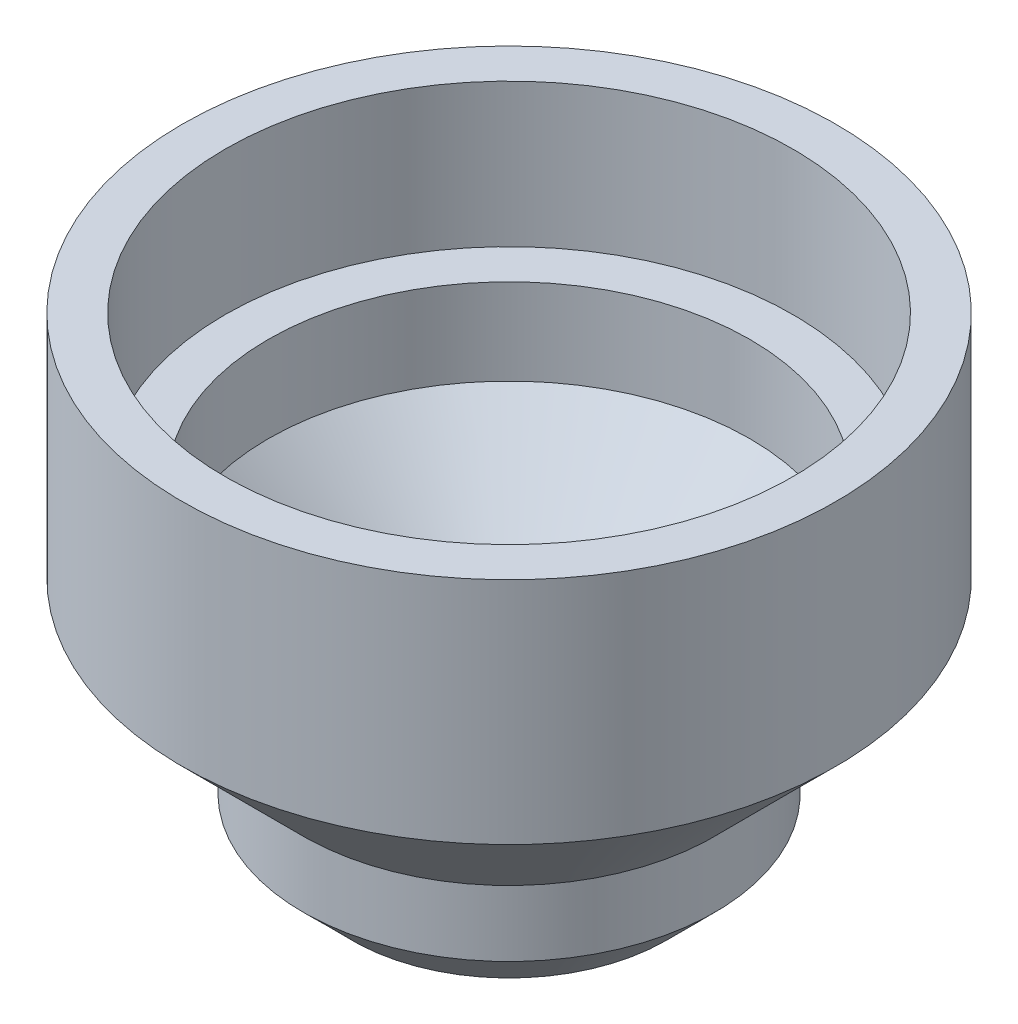
ISO-10303-21;
HEADER;
FILE_DESCRIPTION(('STEP AP214'),'2;1');
FILE_NAME('part.step','',(''),(''),'','','');
FILE_SCHEMA(('AUTOMOTIVE_DESIGN { 1 0 10303 214 1 1 1 1 }'));
ENDSEC;
DATA;
#1=APPLICATION_CONTEXT('core data for automotive mechanical design processes');
#2=APPLICATION_PROTOCOL_DEFINITION('international standard','automotive_design',2000,#1);
#3=PRODUCT_CONTEXT('',#1,'mechanical');
#4=PRODUCT('Part','Part','',(#3));
#5=PRODUCT_RELATED_PRODUCT_CATEGORY('part','',(#4));
#6=PRODUCT_DEFINITION_FORMATION('','',#4);
#7=PRODUCT_DEFINITION_CONTEXT('part definition',#1,'design');
#8=PRODUCT_DEFINITION('design','',#6,#7);
#9=PRODUCT_DEFINITION_SHAPE('','',#8);
#10=(LENGTH_UNIT() NAMED_UNIT(*) SI_UNIT(.MILLI.,.METRE.));
#11=(NAMED_UNIT(*) PLANE_ANGLE_UNIT() SI_UNIT($,.RADIAN.));
#12=(NAMED_UNIT(*) SI_UNIT($,.STERADIAN.) SOLID_ANGLE_UNIT());
#13=UNCERTAINTY_MEASURE_WITH_UNIT(LENGTH_MEASURE(1.E-05),#10,'distance_accuracy_value','');
#14=(GEOMETRIC_REPRESENTATION_CONTEXT(3) GLOBAL_UNCERTAINTY_ASSIGNED_CONTEXT((#13)) GLOBAL_UNIT_ASSIGNED_CONTEXT((#10,
#11,#12)) REPRESENTATION_CONTEXT('',''));
#15=CARTESIAN_POINT('',(0.,0.,0.));
#16=DIRECTION('',(0.,0.,1.));
#17=DIRECTION('',(1.,0.,0.));
#18=AXIS2_PLACEMENT_3D('',#15,#16,#17);
#19=CARTESIAN_POINT('',(0.,51.2741946401641,0.));
#20=DIRECTION('',(0.,1.,0.));
#21=DIRECTION('',(-1.,0.,0.));
#22=AXIS2_PLACEMENT_3D('',#19,#20,#21);
#23=CYLINDRICAL_SURFACE('',#22,7.18025360760885);
#24=CARTESIAN_POINT('',(0.,-6.51531827806546,0.));
#25=DIRECTION('',(0.,1.,0.));
#26=DIRECTION('',(-1.,0.,0.));
#27=AXIS2_PLACEMENT_3D('',#24,#25,#26);
#28=CIRCLE('',#27,7.18025360760885);
#29=CARTESIAN_POINT('',(-7.18025360760884,-6.51531827806546,0.));
#30=VERTEX_POINT('',#29);
#31=EDGE_CURVE('E72',#30,#30,#28,.T.);
#32=ORIENTED_EDGE('',*,*,#31,.T.);
#33=EDGE_LOOP('',(#32));
#34=FACE_BOUND('',#33,.T.);
#35=CARTESIAN_POINT('',(0.,-4.21974639239114,0.));
#36=DIRECTION('',(0.,1.,0.));
#37=DIRECTION('',(-1.,0.,0.));
#38=AXIS2_PLACEMENT_3D('',#35,#36,#37);
#39=CIRCLE('',#38,7.18025360760885);
#40=CARTESIAN_POINT('',(-7.18025360760884,-4.21974639239114,0.));
#41=VERTEX_POINT('',#40);
#42=EDGE_CURVE('E10',#41,#41,#39,.T.);
#43=ORIENTED_EDGE('',*,*,#42,.F.);
#44=EDGE_LOOP('',(#43));
#45=FACE_BOUND('',#44,.T.);
#46=ADVANCED_FACE('F38',(#34,#45),#23,.T.);
#47=CARTESIAN_POINT('',(0.,0.,0.));
#48=DIRECTION('',(0.,1.,0.));
#49=DIRECTION('',(-1.,0.,0.));
#50=AXIS2_PLACEMENT_3D('',#47,#48,#49);
#51=CONICAL_SURFACE('',#50,11.4,0.785398163397447);
#52=ORIENTED_EDGE('',*,*,#42,.T.);
#53=EDGE_LOOP('',(#52));
#54=FACE_BOUND('',#53,.T.);
#55=CARTESIAN_POINT('',(0.,0.,0.));
#56=DIRECTION('',(0.,1.,0.));
#57=DIRECTION('',(-1.,0.,0.));
#58=AXIS2_PLACEMENT_3D('',#55,#56,#57);
#59=CIRCLE('',#58,11.4);
#60=CARTESIAN_POINT('',(-11.4,0.,0.));
#61=VERTEX_POINT('',#60);
#62=EDGE_CURVE('E44',#61,#61,#59,.T.);
#63=ORIENTED_EDGE('',*,*,#62,.F.);
#64=EDGE_LOOP('',(#63));
#65=FACE_BOUND('',#64,.T.);
#66=ADVANCED_FACE('F114',(#54,#65),#51,.T.);
#67=CARTESIAN_POINT('',(0.,51.2741946401641,0.));
#68=DIRECTION('',(0.,1.,0.));
#69=DIRECTION('',(-1.,0.,0.));
#70=AXIS2_PLACEMENT_3D('',#67,#68,#69);
#71=CYLINDRICAL_SURFACE('',#70,11.4);
#72=CARTESIAN_POINT('',(0.,8.,0.));
#73=DIRECTION('',(0.,1.,0.));
#74=DIRECTION('',(-1.,0.,0.));
#75=AXIS2_PLACEMENT_3D('',#72,#73,#74);
#76=CIRCLE('',#75,11.4);
#77=CARTESIAN_POINT('',(-11.4,8.,0.));
#78=VERTEX_POINT('',#77);
#79=EDGE_CURVE('E48',#78,#78,#76,.T.);
#80=ORIENTED_EDGE('',*,*,#79,.F.);
#81=EDGE_LOOP('',(#80));
#82=FACE_BOUND('',#81,.T.);
#83=ORIENTED_EDGE('',*,*,#62,.T.);
#84=EDGE_LOOP('',(#83));
#85=FACE_BOUND('',#84,.T.);
#86=ADVANCED_FACE('F118',(#82,#85),#71,.T.);
#87=CARTESIAN_POINT('',(0.,8.,0.));
#88=DIRECTION('',(0.,1.,0.));
#89=DIRECTION('',(-1.,0.,0.));
#90=AXIS2_PLACEMENT_3D('',#87,#88,#89);
#91=PLANE('',#90);
#92=ORIENTED_EDGE('',*,*,#79,.T.);
#93=EDGE_LOOP('',(#92));
#94=FACE_BOUND('',#93,.T.);
#95=CARTESIAN_POINT('',(0.,8.,0.));
#96=DIRECTION('',(0.,1.,0.));
#97=DIRECTION('',(-1.,0.,0.));
#98=AXIS2_PLACEMENT_3D('',#95,#96,#97);
#99=CIRCLE('',#98,9.89999999999999);
#100=CARTESIAN_POINT('',(-9.89999999999999,8.,0.));
#101=VERTEX_POINT('',#100);
#102=EDGE_CURVE('E52',#101,#101,#99,.T.);
#103=ORIENTED_EDGE('',*,*,#102,.F.);
#104=EDGE_LOOP('',(#103));
#105=FACE_BOUND('',#104,.T.);
#106=ADVANCED_FACE('F110',(#94,#105),#91,.T.);
#107=CARTESIAN_POINT('',(0.,51.2741946401641,0.));
#108=DIRECTION('',(0.,1.,0.));
#109=DIRECTION('',(-1.,0.,0.));
#110=AXIS2_PLACEMENT_3D('',#107,#108,#109);
#111=CYLINDRICAL_SURFACE('',#110,9.89999999999999);
#112=CARTESIAN_POINT('',(0.,3.,0.));
#113=DIRECTION('',(0.,1.,0.));
#114=DIRECTION('',(-1.,0.,0.));
#115=AXIS2_PLACEMENT_3D('',#112,#113,#114);
#116=CIRCLE('',#115,9.89999999999999);
#117=CARTESIAN_POINT('',(-9.89999999999999,3.,0.));
#118=VERTEX_POINT('',#117);
#119=EDGE_CURVE('E57',#118,#118,#116,.T.);
#120=ORIENTED_EDGE('',*,*,#119,.F.);
#121=EDGE_LOOP('',(#120));
#122=FACE_BOUND('',#121,.T.);
#123=ORIENTED_EDGE('',*,*,#102,.T.);
#124=EDGE_LOOP('',(#123));
#125=FACE_BOUND('',#124,.T.);
#126=ADVANCED_FACE('F104',(#122,#125),#111,.F.);
#127=CARTESIAN_POINT('',(0.,3.,0.));
#128=DIRECTION('',(0.,1.,0.));
#129=DIRECTION('',(-1.,0.,0.));
#130=AXIS2_PLACEMENT_3D('',#127,#128,#129);
#131=PLANE('',#130);
#132=ORIENTED_EDGE('',*,*,#119,.T.);
#133=EDGE_LOOP('',(#132));
#134=FACE_BOUND('',#133,.T.);
#135=CARTESIAN_POINT('',(0.,3.,0.));
#136=DIRECTION('',(0.,1.,0.));
#137=DIRECTION('',(-1.,0.,0.));
#138=AXIS2_PLACEMENT_3D('',#135,#136,#137);
#139=CIRCLE('',#138,8.4);
#140=CARTESIAN_POINT('',(-8.39999999999999,3.,0.));
#141=VERTEX_POINT('',#140);
#142=EDGE_CURVE('E60',#141,#141,#139,.T.);
#143=ORIENTED_EDGE('',*,*,#142,.F.);
#144=EDGE_LOOP('',(#143));
#145=FACE_BOUND('',#144,.T.);
#146=ADVANCED_FACE('F99',(#134,#145),#131,.T.);
#147=CARTESIAN_POINT('',(0.,51.2741946401641,0.));
#148=DIRECTION('',(0.,1.,0.));
#149=DIRECTION('',(-1.,0.,0.));
#150=AXIS2_PLACEMENT_3D('',#147,#148,#149);
#151=CYLINDRICAL_SURFACE('',#150,8.4);
#152=CARTESIAN_POINT('',(0.,0.,0.));
#153=DIRECTION('',(0.,1.,0.));
#154=DIRECTION('',(-1.,0.,0.));
#155=AXIS2_PLACEMENT_3D('',#152,#153,#154);
#156=CIRCLE('',#155,8.4);
#157=CARTESIAN_POINT('',(-8.39999999999999,0.,0.));
#158=VERTEX_POINT('',#157);
#159=EDGE_CURVE('E63',#158,#158,#156,.T.);
#160=ORIENTED_EDGE('',*,*,#159,.F.);
#161=EDGE_LOOP('',(#160));
#162=FACE_BOUND('',#161,.T.);
#163=ORIENTED_EDGE('',*,*,#142,.T.);
#164=EDGE_LOOP('',(#163));
#165=FACE_BOUND('',#164,.T.);
#166=ADVANCED_FACE('F93',(#162,#165),#151,.F.);
#167=CARTESIAN_POINT('',(0.,0.,0.));
#168=DIRECTION('',(0.,1.,0.));
#169=DIRECTION('',(-1.,0.,0.));
#170=AXIS2_PLACEMENT_3D('',#167,#168,#169);
#171=CONICAL_SURFACE('',#170,8.4,0.785398163397448);
#172=CARTESIAN_POINT('',(0.,-2.91974639239114,0.));
#173=DIRECTION('',(0.,1.,0.));
#174=DIRECTION('',(-1.,0.,0.));
#175=AXIS2_PLACEMENT_3D('',#172,#173,#174);
#176=CIRCLE('',#175,5.48025360760885);
#177=CARTESIAN_POINT('',(-5.48025360760884,-2.91974639239114,0.));
#178=VERTEX_POINT('',#177);
#179=EDGE_CURVE('E66',#178,#178,#176,.T.);
#180=ORIENTED_EDGE('',*,*,#179,.F.);
#181=EDGE_LOOP('',(#180));
#182=FACE_BOUND('',#181,.T.);
#183=ORIENTED_EDGE('',*,*,#159,.T.);
#184=EDGE_LOOP('',(#183));
#185=FACE_BOUND('',#184,.T.);
#186=ADVANCED_FACE('F87',(#182,#185),#171,.F.);
#187=CARTESIAN_POINT('',(0.,51.2741946401641,0.));
#188=DIRECTION('',(0.,1.,0.));
#189=DIRECTION('',(-1.,0.,0.));
#190=AXIS2_PLACEMENT_3D('',#187,#188,#189);
#191=CYLINDRICAL_SURFACE('',#190,5.48025360760885);
#192=CARTESIAN_POINT('',(0.,-8.21531827806547,0.));
#193=DIRECTION('',(0.,1.,0.));
#194=DIRECTION('',(-1.,0.,0.));
#195=AXIS2_PLACEMENT_3D('',#192,#193,#194);
#196=CIRCLE('',#195,5.48025360760885);
#197=CARTESIAN_POINT('',(-5.48025360760884,-8.21531827806547,0.));
#198=VERTEX_POINT('',#197);
#199=EDGE_CURVE('E69',#198,#198,#196,.T.);
#200=ORIENTED_EDGE('',*,*,#199,.F.);
#201=EDGE_LOOP('',(#200));
#202=FACE_BOUND('',#201,.T.);
#203=ORIENTED_EDGE('',*,*,#179,.T.);
#204=EDGE_LOOP('',(#203));
#205=FACE_BOUND('',#204,.T.);
#206=ADVANCED_FACE('F81',(#202,#205),#191,.F.);
#207=CARTESIAN_POINT('',(0.,-8.21531827806547,0.));
#208=DIRECTION('',(0.,1.,0.));
#209=DIRECTION('',(-1.,0.,0.));
#210=AXIS2_PLACEMENT_3D('',#207,#208,#209);
#211=CONICAL_SURFACE('',#210,5.48025360760885,0.785398163397446);
#212=ORIENTED_EDGE('',*,*,#31,.F.);
#213=EDGE_LOOP('',(#212));
#214=FACE_BOUND('',#213,.T.);
#215=ORIENTED_EDGE('',*,*,#199,.T.);
#216=EDGE_LOOP('',(#215));
#217=FACE_BOUND('',#216,.T.);
#218=ADVANCED_FACE('F78',(#214,#217),#211,.T.);
#219=CLOSED_SHELL('',(#46,#66,#86,#106,#126,#146,#166,#186,#206,#218));
#220=MANIFOLD_SOLID_BREP('B2',#219);
#221=ADVANCED_BREP_SHAPE_REPRESENTATION('',(#18,#220),#14);
#222=SHAPE_DEFINITION_REPRESENTATION(#9,#221);
ENDSEC;
END-ISO-10303-21;
